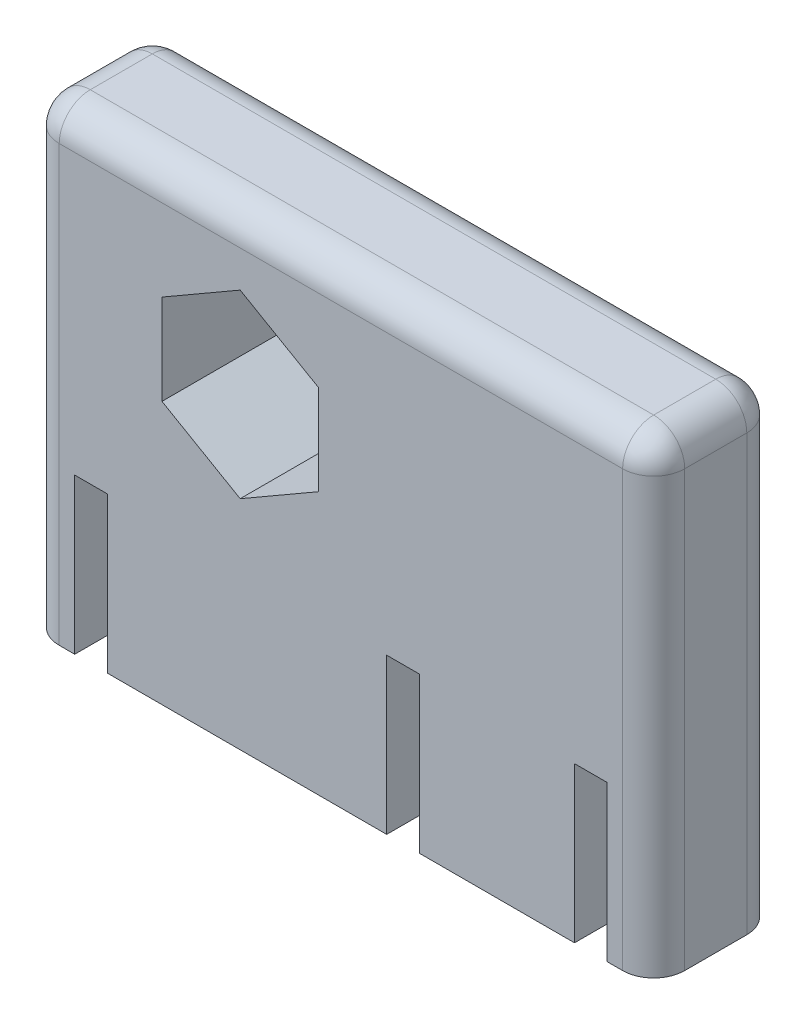
ISO-10303-21;
HEADER;
FILE_DESCRIPTION(('STEP AP214'),'2;1');
FILE_NAME('part.step','',(''),(''),'','','');
FILE_SCHEMA(('AUTOMOTIVE_DESIGN { 1 0 10303 214 1 1 1 1 }'));
ENDSEC;
DATA;
#1=APPLICATION_CONTEXT('core data for automotive mechanical design processes');
#2=APPLICATION_PROTOCOL_DEFINITION('international standard','automotive_design',2000,#1);
#3=PRODUCT_CONTEXT('',#1,'mechanical');
#4=PRODUCT('Part','Part','',(#3));
#5=PRODUCT_RELATED_PRODUCT_CATEGORY('part','',(#4));
#6=PRODUCT_DEFINITION_FORMATION('','',#4);
#7=PRODUCT_DEFINITION_CONTEXT('part definition',#1,'design');
#8=PRODUCT_DEFINITION('design','',#6,#7);
#9=PRODUCT_DEFINITION_SHAPE('','',#8);
#10=(LENGTH_UNIT() NAMED_UNIT(*) SI_UNIT(.MILLI.,.METRE.));
#11=(NAMED_UNIT(*) PLANE_ANGLE_UNIT() SI_UNIT($,.RADIAN.));
#12=(NAMED_UNIT(*) SI_UNIT($,.STERADIAN.) SOLID_ANGLE_UNIT());
#13=UNCERTAINTY_MEASURE_WITH_UNIT(LENGTH_MEASURE(1.E-05),#10,'distance_accuracy_value','');
#14=(GEOMETRIC_REPRESENTATION_CONTEXT(3) GLOBAL_UNCERTAINTY_ASSIGNED_CONTEXT((#13)) GLOBAL_UNIT_ASSIGNED_CONTEXT((#10,
#11,#12)) REPRESENTATION_CONTEXT('',''));
#15=CARTESIAN_POINT('',(0.,0.,0.));
#16=DIRECTION('',(0.,0.,1.));
#17=DIRECTION('',(1.,0.,0.));
#18=AXIS2_PLACEMENT_3D('',#15,#16,#17);
#19=CARTESIAN_POINT('',(0.,0.,8.));
#20=DIRECTION('',(0.,0.,-1.));
#21=DIRECTION('',(-1.,0.,0.));
#22=AXIS2_PLACEMENT_3D('',#19,#20,#21);
#23=PLANE('',#22);
#24=DIRECTION('',(-1.,0.,0.));
#25=VECTOR('',#24,1.);
#26=CARTESIAN_POINT('',(0.,13.,8.));
#27=LINE('',#26,#25);
#28=CARTESIAN_POINT('',(18.15,13.,8.));
#29=VERTEX_POINT('',#28);
#30=CARTESIAN_POINT('',(-18.15,13.,8.));
#31=VERTEX_POINT('',#30);
#32=EDGE_CURVE('E65',#29,#31,#27,.T.);
#33=ORIENTED_EDGE('',*,*,#32,.T.);
#34=DIRECTION('',(0.,-1.,0.));
#35=VECTOR('',#34,1.);
#36=CARTESIAN_POINT('',(-18.15,0.,8.));
#37=LINE('',#36,#35);
#38=CARTESIAN_POINT('',(-18.15,-15.,8.));
#39=VERTEX_POINT('',#38);
#40=EDGE_CURVE('E521',#31,#39,#37,.T.);
#41=ORIENTED_EDGE('',*,*,#40,.T.);
#42=DIRECTION('',(1.,0.,0.));
#43=VECTOR('',#42,1.);
#44=CARTESIAN_POINT('',(-20.15,-15.,8.));
#45=LINE('',#44,#43);
#46=CARTESIAN_POINT('',(-17.15,-15.,8.));
#47=VERTEX_POINT('',#46);
#48=EDGE_CURVE('E312',#39,#47,#45,.T.);
#49=ORIENTED_EDGE('',*,*,#48,.T.);
#50=DIRECTION('',(0.,1.,0.));
#51=VECTOR('',#50,1.);
#52=CARTESIAN_POINT('',(-17.15,-15.,8.));
#53=LINE('',#52,#51);
#54=CARTESIAN_POINT('',(-17.15,-5.,8.));
#55=VERTEX_POINT('',#54);
#56=EDGE_CURVE('E315',#47,#55,#53,.T.);
#57=ORIENTED_EDGE('',*,*,#56,.T.);
#58=DIRECTION('',(1.,0.,0.));
#59=VECTOR('',#58,1.);
#60=CARTESIAN_POINT('',(-17.15,-5.,8.));
#61=LINE('',#60,#59);
#62=CARTESIAN_POINT('',(-15.05,-5.,8.));
#63=VERTEX_POINT('',#62);
#64=EDGE_CURVE('E319',#55,#63,#61,.T.);
#65=ORIENTED_EDGE('',*,*,#64,.T.);
#66=DIRECTION('',(0.,-1.,0.));
#67=VECTOR('',#66,1.);
#68=CARTESIAN_POINT('',(-15.05,-5.,8.));
#69=LINE('',#68,#67);
#70=CARTESIAN_POINT('',(-15.05,-15.,8.));
#71=VERTEX_POINT('',#70);
#72=EDGE_CURVE('E322',#63,#71,#69,.T.);
#73=ORIENTED_EDGE('',*,*,#72,.T.);
#74=DIRECTION('',(1.,0.,0.));
#75=VECTOR('',#74,1.);
#76=CARTESIAN_POINT('',(-15.05,-15.,8.));
#77=LINE('',#76,#75);
#78=CARTESIAN_POINT('',(2.95,-15.,8.));
#79=VERTEX_POINT('',#78);
#80=EDGE_CURVE('E325',#71,#79,#77,.T.);
#81=ORIENTED_EDGE('',*,*,#80,.T.);
#82=DIRECTION('',(0.,1.,0.));
#83=VECTOR('',#82,1.);
#84=CARTESIAN_POINT('',(2.95,-15.,8.));
#85=LINE('',#84,#83);
#86=CARTESIAN_POINT('',(2.95,-5.,8.));
#87=VERTEX_POINT('',#86);
#88=EDGE_CURVE('E328',#79,#87,#85,.T.);
#89=ORIENTED_EDGE('',*,*,#88,.T.);
#90=DIRECTION('',(1.,0.,0.));
#91=VECTOR('',#90,1.);
#92=CARTESIAN_POINT('',(2.95,-5.,8.));
#93=LINE('',#92,#91);
#94=CARTESIAN_POINT('',(5.05,-5.,8.));
#95=VERTEX_POINT('',#94);
#96=EDGE_CURVE('E331',#87,#95,#93,.T.);
#97=ORIENTED_EDGE('',*,*,#96,.T.);
#98=DIRECTION('',(0.,-1.,0.));
#99=VECTOR('',#98,1.);
#100=CARTESIAN_POINT('',(5.05,-5.,8.));
#101=LINE('',#100,#99);
#102=CARTESIAN_POINT('',(5.05,-15.,8.));
#103=VERTEX_POINT('',#102);
#104=EDGE_CURVE('E334',#95,#103,#101,.T.);
#105=ORIENTED_EDGE('',*,*,#104,.T.);
#106=DIRECTION('',(1.,0.,0.));
#107=VECTOR('',#106,1.);
#108=CARTESIAN_POINT('',(5.05,-15.,8.));
#109=LINE('',#108,#107);
#110=CARTESIAN_POINT('',(15.05,-15.,8.));
#111=VERTEX_POINT('',#110);
#112=EDGE_CURVE('E337',#103,#111,#109,.T.);
#113=ORIENTED_EDGE('',*,*,#112,.T.);
#114=DIRECTION('',(0.,1.,0.));
#115=VECTOR('',#114,1.);
#116=CARTESIAN_POINT('',(15.05,-15.,8.));
#117=LINE('',#116,#115);
#118=CARTESIAN_POINT('',(15.05,-5.,8.));
#119=VERTEX_POINT('',#118);
#120=EDGE_CURVE('E340',#111,#119,#117,.T.);
#121=ORIENTED_EDGE('',*,*,#120,.T.);
#122=DIRECTION('',(1.,0.,0.));
#123=VECTOR('',#122,1.);
#124=CARTESIAN_POINT('',(15.05,-5.,8.));
#125=LINE('',#124,#123);
#126=CARTESIAN_POINT('',(17.15,-5.,8.));
#127=VERTEX_POINT('',#126);
#128=EDGE_CURVE('E343',#119,#127,#125,.T.);
#129=ORIENTED_EDGE('',*,*,#128,.T.);
#130=DIRECTION('',(0.,-1.,0.));
#131=VECTOR('',#130,1.);
#132=CARTESIAN_POINT('',(17.15,-5.,8.));
#133=LINE('',#132,#131);
#134=CARTESIAN_POINT('',(17.15,-15.,8.));
#135=VERTEX_POINT('',#134);
#136=EDGE_CURVE('E346',#127,#135,#133,.T.);
#137=ORIENTED_EDGE('',*,*,#136,.T.);
#138=DIRECTION('',(1.,0.,0.));
#139=VECTOR('',#138,1.);
#140=CARTESIAN_POINT('',(17.15,-15.,8.));
#141=LINE('',#140,#139);
#142=CARTESIAN_POINT('',(18.15,-15.,8.));
#143=VERTEX_POINT('',#142);
#144=EDGE_CURVE('E349',#135,#143,#141,.T.);
#145=ORIENTED_EDGE('',*,*,#144,.T.);
#146=DIRECTION('',(0.,1.,0.));
#147=VECTOR('',#146,1.);
#148=CARTESIAN_POINT('',(18.15,0.,8.));
#149=LINE('',#148,#147);
#150=EDGE_CURVE('E455',#143,#29,#149,.T.);
#151=ORIENTED_EDGE('',*,*,#150,.T.);
#152=EDGE_LOOP('',(#33,#41,#49,#57,#65,#73,#81,#89,#97,#105,#113,#121,#129,#137,#145,#151));
#153=FACE_BOUND('',#152,.T.);
#154=DIRECTION('',(0.,1.,0.));
#155=VECTOR('',#154,1.);
#156=CARTESIAN_POINT('',(-1.44979779988866,1.92126963079441,8.));
#157=LINE('',#156,#155);
#158=CARTESIAN_POINT('',(-1.44979779988866,1.92126963079441,8.));
#159=VERTEX_POINT('',#158);
#160=CARTESIAN_POINT('',(-1.44979779988862,7.74096034422584,8.));
#161=VERTEX_POINT('',#160);
#162=EDGE_CURVE('E237',#159,#161,#157,.T.);
#163=ORIENTED_EDGE('',*,*,#162,.F.);
#164=DIRECTION('',(0.866025403784442,0.499999999999994,0.));
#165=VECTOR('',#164,1.);
#166=CARTESIAN_POINT('',(-6.48979779988868,-0.988575725921271,8.));
#167=LINE('',#166,#165);
#168=CARTESIAN_POINT('',(-6.48979779988868,-0.98857572592127,8.));
#169=VERTEX_POINT('',#168);
#170=EDGE_CURVE('E275',#169,#159,#167,.T.);
#171=ORIENTED_EDGE('',*,*,#170,.F.);
#172=DIRECTION('',(0.866025403784435,-0.500000000000006,0.));
#173=VECTOR('',#172,1.);
#174=CARTESIAN_POINT('',(-11.5297977998887,1.92126963079448,8.));
#175=LINE('',#174,#173);
#176=CARTESIAN_POINT('',(-11.5297977998887,1.92126963079448,8.));
#177=VERTEX_POINT('',#176);
#178=EDGE_CURVE('E271',#177,#169,#175,.T.);
#179=ORIENTED_EDGE('',*,*,#178,.F.);
#180=DIRECTION('',(0.,-1.,0.));
#181=VECTOR('',#180,1.);
#182=CARTESIAN_POINT('',(-11.5297977998886,7.74096034422591,8.));
#183=LINE('',#182,#181);
#184=CARTESIAN_POINT('',(-11.5297977998886,7.74096034422591,8.));
#185=VERTEX_POINT('',#184);
#186=EDGE_CURVE('E266',#185,#177,#183,.T.);
#187=ORIENTED_EDGE('',*,*,#186,.F.);
#188=DIRECTION('',(-0.866025403784442,-0.499999999999994,0.));
#189=VECTOR('',#188,1.);
#190=CARTESIAN_POINT('',(-6.4897977998886,10.6508057009416,8.));
#191=LINE('',#190,#189);
#192=CARTESIAN_POINT('',(-6.4897977998886,10.6508057009416,8.));
#193=VERTEX_POINT('',#192);
#194=EDGE_CURVE('E262',#193,#185,#191,.T.);
#195=ORIENTED_EDGE('',*,*,#194,.F.);
#196=DIRECTION('',(-0.866025403784435,0.500000000000006,0.));
#197=VECTOR('',#196,1.);
#198=CARTESIAN_POINT('',(-1.44979779988862,7.74096034422584,8.));
#199=LINE('',#198,#197);
#200=EDGE_CURVE('E248',#161,#193,#199,.T.);
#201=ORIENTED_EDGE('',*,*,#200,.F.);
#202=EDGE_LOOP('',(#163,#171,#179,#187,#195,#201));
#203=FACE_BOUND('',#202,.T.);
#204=ADVANCED_FACE('F47',(#153,#203),#23,.F.);
#205=CARTESIAN_POINT('',(0.,0.,0.));
#206=DIRECTION('',(0.,0.,-1.));
#207=DIRECTION('',(-1.,0.,0.));
#208=AXIS2_PLACEMENT_3D('',#205,#206,#207);
#209=PLANE('',#208);
#210=DIRECTION('',(1.,0.,0.));
#211=VECTOR('',#210,1.);
#212=CARTESIAN_POINT('',(-20.15,-15.,0.));
#213=LINE('',#212,#211);
#214=CARTESIAN_POINT('',(-18.15,-15.,0.));
#215=VERTEX_POINT('',#214);
#216=CARTESIAN_POINT('',(-17.15,-15.,0.));
#217=VERTEX_POINT('',#216);
#218=EDGE_CURVE('E257',#215,#217,#213,.T.);
#219=ORIENTED_EDGE('',*,*,#218,.F.);
#220=DIRECTION('',(0.,-1.,0.));
#221=VECTOR('',#220,1.);
#222=CARTESIAN_POINT('',(-18.15,13.,0.));
#223=LINE('',#222,#221);
#224=CARTESIAN_POINT('',(-18.15,13.,0.));
#225=VERTEX_POINT('',#224);
#226=EDGE_CURVE('E73',#215,#225,#223,.F.);
#227=ORIENTED_EDGE('',*,*,#226,.T.);
#228=DIRECTION('',(-1.,0.,0.));
#229=VECTOR('',#228,1.);
#230=CARTESIAN_POINT('',(18.15,13.,0.));
#231=LINE('',#230,#229);
#232=CARTESIAN_POINT('',(18.15,13.,0.));
#233=VERTEX_POINT('',#232);
#234=EDGE_CURVE('E514',#225,#233,#231,.F.);
#235=ORIENTED_EDGE('',*,*,#234,.T.);
#236=DIRECTION('',(0.,1.,0.));
#237=VECTOR('',#236,1.);
#238=CARTESIAN_POINT('',(18.15,-15.,0.));
#239=LINE('',#238,#237);
#240=CARTESIAN_POINT('',(18.15,-15.,0.));
#241=VERTEX_POINT('',#240);
#242=EDGE_CURVE('E475',#233,#241,#239,.F.);
#243=ORIENTED_EDGE('',*,*,#242,.T.);
#244=DIRECTION('',(1.,0.,0.));
#245=VECTOR('',#244,1.);
#246=CARTESIAN_POINT('',(17.15,-15.,0.));
#247=LINE('',#246,#245);
#248=CARTESIAN_POINT('',(17.15,-15.,0.));
#249=VERTEX_POINT('',#248);
#250=EDGE_CURVE('E316',#249,#241,#247,.T.);
#251=ORIENTED_EDGE('',*,*,#250,.F.);
#252=DIRECTION('',(0.,-1.,0.));
#253=VECTOR('',#252,1.);
#254=CARTESIAN_POINT('',(17.15,-5.,0.));
#255=LINE('',#254,#253);
#256=CARTESIAN_POINT('',(17.15,-5.,0.));
#257=VERTEX_POINT('',#256);
#258=EDGE_CURVE('E386',#257,#249,#255,.T.);
#259=ORIENTED_EDGE('',*,*,#258,.F.);
#260=DIRECTION('',(1.,0.,0.));
#261=VECTOR('',#260,1.);
#262=CARTESIAN_POINT('',(15.05,-5.,0.));
#263=LINE('',#262,#261);
#264=CARTESIAN_POINT('',(15.05,-5.,0.));
#265=VERTEX_POINT('',#264);
#266=EDGE_CURVE('E383',#265,#257,#263,.T.);
#267=ORIENTED_EDGE('',*,*,#266,.F.);
#268=DIRECTION('',(0.,1.,0.));
#269=VECTOR('',#268,1.);
#270=CARTESIAN_POINT('',(15.05,-15.,0.));
#271=LINE('',#270,#269);
#272=CARTESIAN_POINT('',(15.05,-15.,0.));
#273=VERTEX_POINT('',#272);
#274=EDGE_CURVE('E380',#273,#265,#271,.T.);
#275=ORIENTED_EDGE('',*,*,#274,.F.);
#276=DIRECTION('',(1.,0.,0.));
#277=VECTOR('',#276,1.);
#278=CARTESIAN_POINT('',(5.05,-15.,0.));
#279=LINE('',#278,#277);
#280=CARTESIAN_POINT('',(5.05,-15.,0.));
#281=VERTEX_POINT('',#280);
#282=EDGE_CURVE('E377',#281,#273,#279,.T.);
#283=ORIENTED_EDGE('',*,*,#282,.F.);
#284=DIRECTION('',(0.,-1.,0.));
#285=VECTOR('',#284,1.);
#286=CARTESIAN_POINT('',(5.05,-5.,0.));
#287=LINE('',#286,#285);
#288=CARTESIAN_POINT('',(5.05,-5.,0.));
#289=VERTEX_POINT('',#288);
#290=EDGE_CURVE('E374',#289,#281,#287,.T.);
#291=ORIENTED_EDGE('',*,*,#290,.F.);
#292=DIRECTION('',(1.,0.,0.));
#293=VECTOR('',#292,1.);
#294=CARTESIAN_POINT('',(2.95,-5.,0.));
#295=LINE('',#294,#293);
#296=CARTESIAN_POINT('',(2.95,-5.,0.));
#297=VERTEX_POINT('',#296);
#298=EDGE_CURVE('E371',#297,#289,#295,.T.);
#299=ORIENTED_EDGE('',*,*,#298,.F.);
#300=DIRECTION('',(0.,1.,0.));
#301=VECTOR('',#300,1.);
#302=CARTESIAN_POINT('',(2.95,-15.,0.));
#303=LINE('',#302,#301);
#304=CARTESIAN_POINT('',(2.95,-15.,0.));
#305=VERTEX_POINT('',#304);
#306=EDGE_CURVE('E368',#305,#297,#303,.T.);
#307=ORIENTED_EDGE('',*,*,#306,.F.);
#308=DIRECTION('',(1.,0.,0.));
#309=VECTOR('',#308,1.);
#310=CARTESIAN_POINT('',(-15.05,-15.,0.));
#311=LINE('',#310,#309);
#312=CARTESIAN_POINT('',(-15.05,-15.,0.));
#313=VERTEX_POINT('',#312);
#314=EDGE_CURVE('E365',#313,#305,#311,.T.);
#315=ORIENTED_EDGE('',*,*,#314,.F.);
#316=DIRECTION('',(0.,-1.,0.));
#317=VECTOR('',#316,1.);
#318=CARTESIAN_POINT('',(-15.05,-5.,0.));
#319=LINE('',#318,#317);
#320=CARTESIAN_POINT('',(-15.05,-5.,0.));
#321=VERTEX_POINT('',#320);
#322=EDGE_CURVE('E362',#321,#313,#319,.T.);
#323=ORIENTED_EDGE('',*,*,#322,.F.);
#324=DIRECTION('',(1.,0.,0.));
#325=VECTOR('',#324,1.);
#326=CARTESIAN_POINT('',(-17.15,-5.,0.));
#327=LINE('',#326,#325);
#328=CARTESIAN_POINT('',(-17.15,-5.,0.));
#329=VERTEX_POINT('',#328);
#330=EDGE_CURVE('E359',#329,#321,#327,.T.);
#331=ORIENTED_EDGE('',*,*,#330,.F.);
#332=DIRECTION('',(0.,1.,0.));
#333=VECTOR('',#332,1.);
#334=CARTESIAN_POINT('',(-17.15,-15.,0.));
#335=LINE('',#334,#333);
#336=EDGE_CURVE('E356',#217,#329,#335,.T.);
#337=ORIENTED_EDGE('',*,*,#336,.F.);
#338=EDGE_LOOP('',(#219,#227,#235,#243,#251,#259,#267,#275,#283,#291,#299,#307,#315,#323,#331,#337));
#339=FACE_BOUND('',#338,.T.);
#340=DIRECTION('',(0.866025403784442,0.499999999999994,0.));
#341=VECTOR('',#340,1.);
#342=CARTESIAN_POINT('',(-6.48979779988868,-0.988575725921271,0.));
#343=LINE('',#342,#341);
#344=CARTESIAN_POINT('',(-6.48979779988868,-0.988575725921271,0.));
#345=VERTEX_POINT('',#344);
#346=CARTESIAN_POINT('',(-1.44979779988866,1.92126963079441,0.));
#347=VERTEX_POINT('',#346);
#348=EDGE_CURVE('E249',#345,#347,#343,.T.);
#349=ORIENTED_EDGE('',*,*,#348,.T.);
#350=DIRECTION('',(0.,1.,0.));
#351=VECTOR('',#350,1.);
#352=CARTESIAN_POINT('',(-1.44979779988866,1.92126963079441,0.));
#353=LINE('',#352,#351);
#354=CARTESIAN_POINT('',(-1.44979779988862,7.74096034422584,0.));
#355=VERTEX_POINT('',#354);
#356=EDGE_CURVE('E278',#347,#355,#353,.T.);
#357=ORIENTED_EDGE('',*,*,#356,.T.);
#358=DIRECTION('',(-0.866025403784435,0.500000000000006,0.));
#359=VECTOR('',#358,1.);
#360=CARTESIAN_POINT('',(-1.44979779988862,7.74096034422584,0.));
#361=LINE('',#360,#359);
#362=CARTESIAN_POINT('',(-6.4897977998886,10.6508057009416,0.));
#363=VERTEX_POINT('',#362);
#364=EDGE_CURVE('E255',#355,#363,#361,.T.);
#365=ORIENTED_EDGE('',*,*,#364,.T.);
#366=DIRECTION('',(-0.866025403784442,-0.499999999999994,0.));
#367=VECTOR('',#366,1.);
#368=CARTESIAN_POINT('',(-6.4897977998886,10.6508057009416,0.));
#369=LINE('',#368,#367);
#370=CARTESIAN_POINT('',(-11.5297977998886,7.74096034422591,0.));
#371=VERTEX_POINT('',#370);
#372=EDGE_CURVE('E284',#363,#371,#369,.T.);
#373=ORIENTED_EDGE('',*,*,#372,.T.);
#374=DIRECTION('',(0.,-1.,0.));
#375=VECTOR('',#374,1.);
#376=CARTESIAN_POINT('',(-11.5297977998886,7.74096034422591,0.));
#377=LINE('',#376,#375);
#378=CARTESIAN_POINT('',(-11.5297977998887,1.92126963079448,0.));
#379=VERTEX_POINT('',#378);
#380=EDGE_CURVE('E288',#371,#379,#377,.T.);
#381=ORIENTED_EDGE('',*,*,#380,.T.);
#382=DIRECTION('',(0.866025403784435,-0.500000000000006,0.));
#383=VECTOR('',#382,1.);
#384=CARTESIAN_POINT('',(-11.5297977998887,1.92126963079448,0.));
#385=LINE('',#384,#383);
#386=EDGE_CURVE('E292',#379,#345,#385,.T.);
#387=ORIENTED_EDGE('',*,*,#386,.T.);
#388=EDGE_LOOP('',(#349,#357,#365,#373,#381,#387));
#389=FACE_BOUND('',#388,.T.);
#390=ADVANCED_FACE('F609',(#339,#389),#209,.T.);
#391=CARTESIAN_POINT('',(20.15,-15.,8.));
#392=DIRECTION('',(-1.,0.,0.));
#393=DIRECTION('',(0.,0.,1.));
#394=AXIS2_PLACEMENT_3D('',#391,#392,#393);
#395=PLANE('',#394);
#396=DIRECTION('',(0.,0.,-1.));
#397=VECTOR('',#396,1.);
#398=CARTESIAN_POINT('',(20.15,13.,8.));
#399=LINE('',#398,#397);
#400=CARTESIAN_POINT('',(20.15,13.,2.));
#401=VERTEX_POINT('',#400);
#402=CARTESIAN_POINT('',(20.15,13.,6.));
#403=VERTEX_POINT('',#402);
#404=EDGE_CURVE('E458',#401,#403,#399,.F.);
#405=ORIENTED_EDGE('',*,*,#404,.T.);
#406=DIRECTION('',(0.,1.,0.));
#407=VECTOR('',#406,1.);
#408=CARTESIAN_POINT('',(20.15,-15.,6.));
#409=LINE('',#408,#407);
#410=CARTESIAN_POINT('',(20.15,-15.,6.));
#411=VERTEX_POINT('',#410);
#412=EDGE_CURVE('E466',#403,#411,#409,.F.);
#413=ORIENTED_EDGE('',*,*,#412,.T.);
#414=DIRECTION('',(0.,0.,-1.));
#415=VECTOR('',#414,1.);
#416=CARTESIAN_POINT('',(20.15,-15.,8.));
#417=LINE('',#416,#415);
#418=CARTESIAN_POINT('',(20.15,-15.,2.));
#419=VERTEX_POINT('',#418);
#420=EDGE_CURVE('E353',#411,#419,#417,.T.);
#421=ORIENTED_EDGE('',*,*,#420,.T.);
#422=DIRECTION('',(0.,1.,0.));
#423=VECTOR('',#422,1.);
#424=CARTESIAN_POINT('',(20.15,15.,2.));
#425=LINE('',#424,#423);
#426=EDGE_CURVE('E462',#419,#401,#425,.T.);
#427=ORIENTED_EDGE('',*,*,#426,.T.);
#428=EDGE_LOOP('',(#405,#413,#421,#427));
#429=FACE_BOUND('',#428,.T.);
#430=ADVANCED_FACE('F590',(#429),#395,.F.);
#431=CARTESIAN_POINT('',(-20.15,15.,8.));
#432=DIRECTION('',(0.,-1.,0.));
#433=DIRECTION('',(0.,0.,-1.));
#434=AXIS2_PLACEMENT_3D('',#431,#432,#433);
#435=PLANE('',#434);
#436=DIRECTION('',(0.,0.,-1.));
#437=VECTOR('',#436,1.);
#438=CARTESIAN_POINT('',(-18.15,15.,8.));
#439=LINE('',#438,#437);
#440=CARTESIAN_POINT('',(-18.15,15.,2.));
#441=VERTEX_POINT('',#440);
#442=CARTESIAN_POINT('',(-18.15,15.,6.));
#443=VERTEX_POINT('',#442);
#444=EDGE_CURVE('E451',#441,#443,#439,.F.);
#445=ORIENTED_EDGE('',*,*,#444,.T.);
#446=DIRECTION('',(-1.,0.,0.));
#447=VECTOR('',#446,1.);
#448=CARTESIAN_POINT('',(-20.15,15.,6.));
#449=LINE('',#448,#447);
#450=CARTESIAN_POINT('',(18.15,15.,6.));
#451=VERTEX_POINT('',#450);
#452=EDGE_CURVE('E11',#443,#451,#449,.F.);
#453=ORIENTED_EDGE('',*,*,#452,.T.);
#454=DIRECTION('',(0.,0.,-1.));
#455=VECTOR('',#454,1.);
#456=CARTESIAN_POINT('',(18.15,15.,8.));
#457=LINE('',#456,#455);
#458=CARTESIAN_POINT('',(18.15,15.,2.));
#459=VERTEX_POINT('',#458);
#460=EDGE_CURVE('E478',#451,#459,#457,.T.);
#461=ORIENTED_EDGE('',*,*,#460,.T.);
#462=DIRECTION('',(-1.,0.,0.));
#463=VECTOR('',#462,1.);
#464=CARTESIAN_POINT('',(-18.15,15.,2.));
#465=LINE('',#464,#463);
#466=EDGE_CURVE('E57',#459,#441,#465,.T.);
#467=ORIENTED_EDGE('',*,*,#466,.T.);
#468=EDGE_LOOP('',(#445,#453,#461,#467));
#469=FACE_BOUND('',#468,.T.);
#470=ADVANCED_FACE('F572',(#469),#435,.F.);
#471=CARTESIAN_POINT('',(-20.15,-15.,8.));
#472=DIRECTION('',(1.,0.,0.));
#473=DIRECTION('',(0.,0.,-1.));
#474=AXIS2_PLACEMENT_3D('',#471,#472,#473);
#475=PLANE('',#474);
#476=DIRECTION('',(0.,0.,-1.));
#477=VECTOR('',#476,1.);
#478=CARTESIAN_POINT('',(-20.15,13.,8.));
#479=LINE('',#478,#477);
#480=CARTESIAN_POINT('',(-20.15,13.,6.));
#481=VERTEX_POINT('',#480);
#482=CARTESIAN_POINT('',(-20.15,13.,2.));
#483=VERTEX_POINT('',#482);
#484=EDGE_CURVE('E447',#481,#483,#479,.T.);
#485=ORIENTED_EDGE('',*,*,#484,.T.);
#486=DIRECTION('',(0.,-1.,0.));
#487=VECTOR('',#486,1.);
#488=CARTESIAN_POINT('',(-20.15,-15.,2.));
#489=LINE('',#488,#487);
#490=CARTESIAN_POINT('',(-20.15,-15.,2.));
#491=VERTEX_POINT('',#490);
#492=EDGE_CURVE('E505',#483,#491,#489,.T.);
#493=ORIENTED_EDGE('',*,*,#492,.T.);
#494=DIRECTION('',(0.,0.,-1.));
#495=VECTOR('',#494,1.);
#496=CARTESIAN_POINT('',(-20.15,-15.,8.));
#497=LINE('',#496,#495);
#498=CARTESIAN_POINT('',(-20.15,-15.,6.));
#499=VERTEX_POINT('',#498);
#500=EDGE_CURVE('E443',#499,#491,#497,.T.);
#501=ORIENTED_EDGE('',*,*,#500,.F.);
#502=DIRECTION('',(0.,-1.,0.));
#503=VECTOR('',#502,1.);
#504=CARTESIAN_POINT('',(-20.15,-15.,6.));
#505=LINE('',#504,#503);
#506=EDGE_CURVE('E502',#499,#481,#505,.F.);
#507=ORIENTED_EDGE('',*,*,#506,.T.);
#508=EDGE_LOOP('',(#485,#493,#501,#507));
#509=FACE_BOUND('',#508,.T.);
#510=ADVANCED_FACE('F555',(#509),#475,.F.);
#511=CARTESIAN_POINT('',(-20.15,-15.,8.));
#512=DIRECTION('',(0.,1.,0.));
#513=DIRECTION('',(0.,0.,1.));
#514=AXIS2_PLACEMENT_3D('',#511,#512,#513);
#515=PLANE('',#514);
#516=ORIENTED_EDGE('',*,*,#500,.T.);
#517=CARTESIAN_POINT('',(-18.15,-15.,2.));
#518=DIRECTION('',(0.,1.,0.));
#519=DIRECTION('',(0.,0.,1.));
#520=AXIS2_PLACEMENT_3D('',#517,#518,#519);
#521=CIRCLE('',#520,2.);
#522=EDGE_CURVE('E511',#491,#215,#521,.F.);
#523=ORIENTED_EDGE('',*,*,#522,.T.);
#524=ORIENTED_EDGE('',*,*,#218,.T.);
#525=DIRECTION('',(0.,0.,-1.));
#526=VECTOR('',#525,1.);
#527=CARTESIAN_POINT('',(-17.15,-15.,8.));
#528=LINE('',#527,#526);
#529=EDGE_CURVE('E439',#47,#217,#528,.T.);
#530=ORIENTED_EDGE('',*,*,#529,.F.);
#531=ORIENTED_EDGE('',*,*,#48,.F.);
#532=CARTESIAN_POINT('',(-18.15,-15.,6.));
#533=DIRECTION('',(0.,1.,0.));
#534=DIRECTION('',(0.,0.,1.));
#535=AXIS2_PLACEMENT_3D('',#532,#533,#534);
#536=CIRCLE('',#535,2.);
#537=EDGE_CURVE('E508',#39,#499,#536,.F.);
#538=ORIENTED_EDGE('',*,*,#537,.T.);
#539=EDGE_LOOP('',(#516,#523,#524,#530,#531,#538));
#540=FACE_BOUND('',#539,.T.);
#541=ADVANCED_FACE('F559',(#540),#515,.F.);
#542=CARTESIAN_POINT('',(-17.15,-15.,8.));
#543=DIRECTION('',(-1.,0.,0.));
#544=DIRECTION('',(0.,-1.,0.));
#545=AXIS2_PLACEMENT_3D('',#542,#543,#544);
#546=PLANE('',#545);
#547=ORIENTED_EDGE('',*,*,#336,.T.);
#548=DIRECTION('',(0.,0.,-1.));
#549=VECTOR('',#548,1.);
#550=CARTESIAN_POINT('',(-17.15,-5.,8.));
#551=LINE('',#550,#549);
#552=EDGE_CURVE('E435',#55,#329,#551,.T.);
#553=ORIENTED_EDGE('',*,*,#552,.F.);
#554=ORIENTED_EDGE('',*,*,#56,.F.);
#555=ORIENTED_EDGE('',*,*,#529,.T.);
#556=EDGE_LOOP('',(#547,#553,#554,#555));
#557=FACE_BOUND('',#556,.T.);
#558=ADVANCED_FACE('F675',(#557),#546,.F.);
#559=CARTESIAN_POINT('',(-17.15,-5.,8.));
#560=DIRECTION('',(0.,1.,0.));
#561=DIRECTION('',(0.,0.,1.));
#562=AXIS2_PLACEMENT_3D('',#559,#560,#561);
#563=PLANE('',#562);
#564=ORIENTED_EDGE('',*,*,#330,.T.);
#565=DIRECTION('',(0.,0.,-1.));
#566=VECTOR('',#565,1.);
#567=CARTESIAN_POINT('',(-15.05,-5.,8.));
#568=LINE('',#567,#566);
#569=EDGE_CURVE('E431',#63,#321,#568,.T.);
#570=ORIENTED_EDGE('',*,*,#569,.F.);
#571=ORIENTED_EDGE('',*,*,#64,.F.);
#572=ORIENTED_EDGE('',*,*,#552,.T.);
#573=EDGE_LOOP('',(#564,#570,#571,#572));
#574=FACE_BOUND('',#573,.T.);
#575=ADVANCED_FACE('F671',(#574),#563,.F.);
#576=CARTESIAN_POINT('',(-15.05,-5.,8.));
#577=DIRECTION('',(1.,0.,0.));
#578=DIRECTION('',(0.,1.,0.));
#579=AXIS2_PLACEMENT_3D('',#576,#577,#578);
#580=PLANE('',#579);
#581=ORIENTED_EDGE('',*,*,#322,.T.);
#582=DIRECTION('',(0.,0.,-1.));
#583=VECTOR('',#582,1.);
#584=CARTESIAN_POINT('',(-15.05,-15.,8.));
#585=LINE('',#584,#583);
#586=EDGE_CURVE('E427',#71,#313,#585,.T.);
#587=ORIENTED_EDGE('',*,*,#586,.F.);
#588=ORIENTED_EDGE('',*,*,#72,.F.);
#589=ORIENTED_EDGE('',*,*,#569,.T.);
#590=EDGE_LOOP('',(#581,#587,#588,#589));
#591=FACE_BOUND('',#590,.T.);
#592=ADVANCED_FACE('F667',(#591),#580,.F.);
#593=CARTESIAN_POINT('',(-15.05,-15.,8.));
#594=DIRECTION('',(0.,1.,0.));
#595=DIRECTION('',(0.,0.,1.));
#596=AXIS2_PLACEMENT_3D('',#593,#594,#595);
#597=PLANE('',#596);
#598=ORIENTED_EDGE('',*,*,#314,.T.);
#599=DIRECTION('',(0.,0.,-1.));
#600=VECTOR('',#599,1.);
#601=CARTESIAN_POINT('',(2.95,-15.,8.));
#602=LINE('',#601,#600);
#603=EDGE_CURVE('E423',#79,#305,#602,.T.);
#604=ORIENTED_EDGE('',*,*,#603,.F.);
#605=ORIENTED_EDGE('',*,*,#80,.F.);
#606=ORIENTED_EDGE('',*,*,#586,.T.);
#607=EDGE_LOOP('',(#598,#604,#605,#606));
#608=FACE_BOUND('',#607,.T.);
#609=ADVANCED_FACE('F663',(#608),#597,.F.);
#610=CARTESIAN_POINT('',(2.95,-15.,8.));
#611=DIRECTION('',(-1.,0.,0.));
#612=DIRECTION('',(0.,-1.,0.));
#613=AXIS2_PLACEMENT_3D('',#610,#611,#612);
#614=PLANE('',#613);
#615=ORIENTED_EDGE('',*,*,#306,.T.);
#616=DIRECTION('',(0.,0.,-1.));
#617=VECTOR('',#616,1.);
#618=CARTESIAN_POINT('',(2.95,-5.,8.));
#619=LINE('',#618,#617);
#620=EDGE_CURVE('E419',#87,#297,#619,.T.);
#621=ORIENTED_EDGE('',*,*,#620,.F.);
#622=ORIENTED_EDGE('',*,*,#88,.F.);
#623=ORIENTED_EDGE('',*,*,#603,.T.);
#624=EDGE_LOOP('',(#615,#621,#622,#623));
#625=FACE_BOUND('',#624,.T.);
#626=ADVANCED_FACE('F659',(#625),#614,.F.);
#627=CARTESIAN_POINT('',(2.95,-5.,8.));
#628=DIRECTION('',(0.,1.,0.));
#629=DIRECTION('',(0.,0.,1.));
#630=AXIS2_PLACEMENT_3D('',#627,#628,#629);
#631=PLANE('',#630);
#632=ORIENTED_EDGE('',*,*,#298,.T.);
#633=DIRECTION('',(0.,0.,-1.));
#634=VECTOR('',#633,1.);
#635=CARTESIAN_POINT('',(5.05,-5.,8.));
#636=LINE('',#635,#634);
#637=EDGE_CURVE('E415',#95,#289,#636,.T.);
#638=ORIENTED_EDGE('',*,*,#637,.F.);
#639=ORIENTED_EDGE('',*,*,#96,.F.);
#640=ORIENTED_EDGE('',*,*,#620,.T.);
#641=EDGE_LOOP('',(#632,#638,#639,#640));
#642=FACE_BOUND('',#641,.T.);
#643=ADVANCED_FACE('F655',(#642),#631,.F.);
#644=CARTESIAN_POINT('',(5.05,-5.,8.));
#645=DIRECTION('',(1.,0.,0.));
#646=DIRECTION('',(0.,1.,0.));
#647=AXIS2_PLACEMENT_3D('',#644,#645,#646);
#648=PLANE('',#647);
#649=ORIENTED_EDGE('',*,*,#290,.T.);
#650=DIRECTION('',(0.,0.,-1.));
#651=VECTOR('',#650,1.);
#652=CARTESIAN_POINT('',(5.05,-15.,8.));
#653=LINE('',#652,#651);
#654=EDGE_CURVE('E411',#103,#281,#653,.T.);
#655=ORIENTED_EDGE('',*,*,#654,.F.);
#656=ORIENTED_EDGE('',*,*,#104,.F.);
#657=ORIENTED_EDGE('',*,*,#637,.T.);
#658=EDGE_LOOP('',(#649,#655,#656,#657));
#659=FACE_BOUND('',#658,.T.);
#660=ADVANCED_FACE('F651',(#659),#648,.F.);
#661=CARTESIAN_POINT('',(5.05,-15.,8.));
#662=DIRECTION('',(0.,1.,0.));
#663=DIRECTION('',(0.,0.,1.));
#664=AXIS2_PLACEMENT_3D('',#661,#662,#663);
#665=PLANE('',#664);
#666=ORIENTED_EDGE('',*,*,#282,.T.);
#667=DIRECTION('',(0.,0.,-1.));
#668=VECTOR('',#667,1.);
#669=CARTESIAN_POINT('',(15.05,-15.,8.));
#670=LINE('',#669,#668);
#671=EDGE_CURVE('E407',#111,#273,#670,.T.);
#672=ORIENTED_EDGE('',*,*,#671,.F.);
#673=ORIENTED_EDGE('',*,*,#112,.F.);
#674=ORIENTED_EDGE('',*,*,#654,.T.);
#675=EDGE_LOOP('',(#666,#672,#673,#674));
#676=FACE_BOUND('',#675,.T.);
#677=ADVANCED_FACE('F647',(#676),#665,.F.);
#678=CARTESIAN_POINT('',(15.05,-15.,8.));
#679=DIRECTION('',(-1.,0.,0.));
#680=DIRECTION('',(0.,-1.,0.));
#681=AXIS2_PLACEMENT_3D('',#678,#679,#680);
#682=PLANE('',#681);
#683=ORIENTED_EDGE('',*,*,#274,.T.);
#684=DIRECTION('',(0.,0.,-1.));
#685=VECTOR('',#684,1.);
#686=CARTESIAN_POINT('',(15.05,-5.,8.));
#687=LINE('',#686,#685);
#688=EDGE_CURVE('E403',#119,#265,#687,.T.);
#689=ORIENTED_EDGE('',*,*,#688,.F.);
#690=ORIENTED_EDGE('',*,*,#120,.F.);
#691=ORIENTED_EDGE('',*,*,#671,.T.);
#692=EDGE_LOOP('',(#683,#689,#690,#691));
#693=FACE_BOUND('',#692,.T.);
#694=ADVANCED_FACE('F643',(#693),#682,.F.);
#695=CARTESIAN_POINT('',(15.05,-5.,8.));
#696=DIRECTION('',(0.,1.,0.));
#697=DIRECTION('',(0.,0.,1.));
#698=AXIS2_PLACEMENT_3D('',#695,#696,#697);
#699=PLANE('',#698);
#700=ORIENTED_EDGE('',*,*,#266,.T.);
#701=DIRECTION('',(0.,0.,-1.));
#702=VECTOR('',#701,1.);
#703=CARTESIAN_POINT('',(17.15,-5.,8.));
#704=LINE('',#703,#702);
#705=EDGE_CURVE('E399',#127,#257,#704,.T.);
#706=ORIENTED_EDGE('',*,*,#705,.F.);
#707=ORIENTED_EDGE('',*,*,#128,.F.);
#708=ORIENTED_EDGE('',*,*,#688,.T.);
#709=EDGE_LOOP('',(#700,#706,#707,#708));
#710=FACE_BOUND('',#709,.T.);
#711=ADVANCED_FACE('F640',(#710),#699,.F.);
#712=CARTESIAN_POINT('',(17.15,-5.,8.));
#713=DIRECTION('',(1.,0.,0.));
#714=DIRECTION('',(0.,0.,-1.));
#715=AXIS2_PLACEMENT_3D('',#712,#713,#714);
#716=PLANE('',#715);
#717=ORIENTED_EDGE('',*,*,#258,.T.);
#718=DIRECTION('',(0.,0.,-1.));
#719=VECTOR('',#718,1.);
#720=CARTESIAN_POINT('',(17.15,-15.,8.));
#721=LINE('',#720,#719);
#722=EDGE_CURVE('E395',#135,#249,#721,.T.);
#723=ORIENTED_EDGE('',*,*,#722,.F.);
#724=ORIENTED_EDGE('',*,*,#136,.F.);
#725=ORIENTED_EDGE('',*,*,#705,.T.);
#726=EDGE_LOOP('',(#717,#723,#724,#725));
#727=FACE_BOUND('',#726,.T.);
#728=ADVANCED_FACE('F605',(#727),#716,.F.);
#729=CARTESIAN_POINT('',(17.15,-15.,8.));
#730=DIRECTION('',(0.,1.,0.));
#731=DIRECTION('',(0.,0.,1.));
#732=AXIS2_PLACEMENT_3D('',#729,#730,#731);
#733=PLANE('',#732);
#734=ORIENTED_EDGE('',*,*,#420,.F.);
#735=CARTESIAN_POINT('',(18.15,-15.,6.));
#736=DIRECTION('',(0.,1.,0.));
#737=DIRECTION('',(0.,0.,1.));
#738=AXIS2_PLACEMENT_3D('',#735,#736,#737);
#739=CIRCLE('',#738,2.);
#740=EDGE_CURVE('E472',#411,#143,#739,.F.);
#741=ORIENTED_EDGE('',*,*,#740,.T.);
#742=ORIENTED_EDGE('',*,*,#144,.F.);
#743=ORIENTED_EDGE('',*,*,#722,.T.);
#744=ORIENTED_EDGE('',*,*,#250,.T.);
#745=CARTESIAN_POINT('',(18.15,-15.,2.));
#746=DIRECTION('',(0.,1.,0.));
#747=DIRECTION('',(0.,0.,1.));
#748=AXIS2_PLACEMENT_3D('',#745,#746,#747);
#749=CIRCLE('',#748,2.);
#750=EDGE_CURVE('E469',#241,#419,#749,.F.);
#751=ORIENTED_EDGE('',*,*,#750,.T.);
#752=EDGE_LOOP('',(#734,#741,#742,#743,#744,#751));
#753=FACE_BOUND('',#752,.T.);
#754=ADVANCED_FACE('F599',(#753),#733,.F.);
#755=CARTESIAN_POINT('',(-1.44979779988866,1.92126963079441,8.));
#756=DIRECTION('',(-1.,0.,0.));
#757=DIRECTION('',(0.,-1.,0.));
#758=AXIS2_PLACEMENT_3D('',#755,#756,#757);
#759=PLANE('',#758);
#760=ORIENTED_EDGE('',*,*,#356,.F.);
#761=DIRECTION('',(0.,0.,-1.));
#762=VECTOR('',#761,1.);
#763=CARTESIAN_POINT('',(-1.44979779988866,1.92126963079441,8.));
#764=LINE('',#763,#762);
#765=EDGE_CURVE('E243',#159,#347,#764,.T.);
#766=ORIENTED_EDGE('',*,*,#765,.F.);
#767=ORIENTED_EDGE('',*,*,#162,.T.);
#768=DIRECTION('',(0.,0.,-1.));
#769=VECTOR('',#768,1.);
#770=CARTESIAN_POINT('',(-1.44979779988862,7.74096034422584,8.));
#771=LINE('',#770,#769);
#772=EDGE_CURVE('E240',#161,#355,#771,.T.);
#773=ORIENTED_EDGE('',*,*,#772,.T.);
#774=EDGE_LOOP('',(#760,#766,#767,#773));
#775=FACE_BOUND('',#774,.T.);
#776=ADVANCED_FACE('F239',(#775),#759,.T.);
#777=CARTESIAN_POINT('',(-1.44979779988862,7.74096034422584,8.));
#778=DIRECTION('',(-0.500000000000006,-0.866025403784435,0.));
#779=DIRECTION('',(0.866025403784435,-0.500000000000006,0.));
#780=AXIS2_PLACEMENT_3D('',#777,#778,#779);
#781=PLANE('',#780);
#782=ORIENTED_EDGE('',*,*,#364,.F.);
#783=ORIENTED_EDGE('',*,*,#772,.F.);
#784=ORIENTED_EDGE('',*,*,#200,.T.);
#785=DIRECTION('',(0.,0.,-1.));
#786=VECTOR('',#785,1.);
#787=CARTESIAN_POINT('',(-6.4897977998886,10.6508057009416,8.));
#788=LINE('',#787,#786);
#789=EDGE_CURVE('E258',#193,#363,#788,.T.);
#790=ORIENTED_EDGE('',*,*,#789,.T.);
#791=EDGE_LOOP('',(#782,#783,#784,#790));
#792=FACE_BOUND('',#791,.T.);
#793=ADVANCED_FACE('F252',(#792),#781,.T.);
#794=CARTESIAN_POINT('',(-6.4897977998886,10.6508057009416,8.));
#795=DIRECTION('',(0.499999999999994,-0.866025403784442,0.));
#796=DIRECTION('',(0.866025403784442,0.499999999999994,0.));
#797=AXIS2_PLACEMENT_3D('',#794,#795,#796);
#798=PLANE('',#797);
#799=ORIENTED_EDGE('',*,*,#372,.F.);
#800=ORIENTED_EDGE('',*,*,#789,.F.);
#801=ORIENTED_EDGE('',*,*,#194,.T.);
#802=DIRECTION('',(0.,0.,-1.));
#803=VECTOR('',#802,1.);
#804=CARTESIAN_POINT('',(-11.5297977998886,7.74096034422591,8.));
#805=LINE('',#804,#803);
#806=EDGE_CURVE('E307',#185,#371,#805,.T.);
#807=ORIENTED_EDGE('',*,*,#806,.T.);
#808=EDGE_LOOP('',(#799,#800,#801,#807));
#809=FACE_BOUND('',#808,.T.);
#810=ADVANCED_FACE('F803',(#809),#798,.T.);
#811=CARTESIAN_POINT('',(-11.5297977998886,7.74096034422591,8.));
#812=DIRECTION('',(1.,0.,0.));
#813=DIRECTION('',(0.,1.,0.));
#814=AXIS2_PLACEMENT_3D('',#811,#812,#813);
#815=PLANE('',#814);
#816=ORIENTED_EDGE('',*,*,#380,.F.);
#817=ORIENTED_EDGE('',*,*,#806,.F.);
#818=ORIENTED_EDGE('',*,*,#186,.T.);
#819=DIRECTION('',(0.,0.,-1.));
#820=VECTOR('',#819,1.);
#821=CARTESIAN_POINT('',(-11.5297977998887,1.92126963079448,8.));
#822=LINE('',#821,#820);
#823=EDGE_CURVE('E304',#177,#379,#822,.T.);
#824=ORIENTED_EDGE('',*,*,#823,.T.);
#825=EDGE_LOOP('',(#816,#817,#818,#824));
#826=FACE_BOUND('',#825,.T.);
#827=ADVANCED_FACE('F794',(#826),#815,.T.);
#828=CARTESIAN_POINT('',(-11.5297977998887,1.92126963079448,8.));
#829=DIRECTION('',(0.500000000000006,0.866025403784435,0.));
#830=DIRECTION('',(-0.866025403784435,0.500000000000006,0.));
#831=AXIS2_PLACEMENT_3D('',#828,#829,#830);
#832=PLANE('',#831);
#833=ORIENTED_EDGE('',*,*,#386,.F.);
#834=ORIENTED_EDGE('',*,*,#823,.F.);
#835=ORIENTED_EDGE('',*,*,#178,.T.);
#836=DIRECTION('',(0.,0.,-1.));
#837=VECTOR('',#836,1.);
#838=CARTESIAN_POINT('',(-6.48979779988868,-0.988575725921271,8.));
#839=LINE('',#838,#837);
#840=EDGE_CURVE('E301',#169,#345,#839,.T.);
#841=ORIENTED_EDGE('',*,*,#840,.T.);
#842=EDGE_LOOP('',(#833,#834,#835,#841));
#843=FACE_BOUND('',#842,.T.);
#844=ADVANCED_FACE('F785',(#843),#832,.T.);
#845=CARTESIAN_POINT('',(-6.48979779988868,-0.988575725921271,8.));
#846=DIRECTION('',(-0.499999999999994,0.866025403784442,0.));
#847=DIRECTION('',(-0.866025403784442,-0.499999999999994,0.));
#848=AXIS2_PLACEMENT_3D('',#845,#846,#847);
#849=PLANE('',#848);
#850=ORIENTED_EDGE('',*,*,#348,.F.);
#851=ORIENTED_EDGE('',*,*,#840,.F.);
#852=ORIENTED_EDGE('',*,*,#170,.T.);
#853=ORIENTED_EDGE('',*,*,#765,.T.);
#854=EDGE_LOOP('',(#850,#851,#852,#853));
#855=FACE_BOUND('',#854,.T.);
#856=ADVANCED_FACE('F690',(#855),#849,.T.);
#857=CARTESIAN_POINT('',(-18.15,13.,8.));
#858=DIRECTION('',(0.,0.,-1.));
#859=DIRECTION('',(-1.,0.,0.));
#860=AXIS2_PLACEMENT_3D('',#857,#858,#859);
#861=CYLINDRICAL_SURFACE('',#860,2.);
#862=ORIENTED_EDGE('',*,*,#484,.F.);
#863=CARTESIAN_POINT('',(-18.15,13.,6.));
#864=DIRECTION('',(0.,0.,-1.));
#865=DIRECTION('',(-1.,0.,0.));
#866=AXIS2_PLACEMENT_3D('',#863,#864,#865);
#867=CIRCLE('',#866,2.);
#868=EDGE_CURVE('E496',#481,#443,#867,.T.);
#869=ORIENTED_EDGE('',*,*,#868,.T.);
#870=ORIENTED_EDGE('',*,*,#444,.F.);
#871=CARTESIAN_POINT('',(-18.15,13.,2.));
#872=DIRECTION('',(0.,0.,-1.));
#873=DIRECTION('',(-1.,0.,0.));
#874=AXIS2_PLACEMENT_3D('',#871,#872,#873);
#875=CIRCLE('',#874,2.);
#876=EDGE_CURVE('E493',#441,#483,#875,.F.);
#877=ORIENTED_EDGE('',*,*,#876,.T.);
#878=EDGE_LOOP('',(#862,#869,#870,#877));
#879=FACE_BOUND('',#878,.T.);
#880=ADVANCED_FACE('F568',(#879),#861,.T.);
#881=CARTESIAN_POINT('',(18.15,-15.,2.));
#882=DIRECTION('',(0.,-1.,0.));
#883=DIRECTION('',(0.,0.,-1.));
#884=AXIS2_PLACEMENT_3D('',#881,#882,#883);
#885=CYLINDRICAL_SURFACE('',#884,2.);
#886=ORIENTED_EDGE('',*,*,#242,.F.);
#887=CARTESIAN_POINT('',(18.15,13.,2.));
#888=DIRECTION('',(0.,-1.,0.));
#889=DIRECTION('',(0.,0.,-1.));
#890=AXIS2_PLACEMENT_3D('',#887,#888,#889);
#891=CIRCLE('',#890,2.);
#892=EDGE_CURVE('E499',#233,#401,#891,.T.);
#893=ORIENTED_EDGE('',*,*,#892,.T.);
#894=ORIENTED_EDGE('',*,*,#426,.F.);
#895=ORIENTED_EDGE('',*,*,#750,.F.);
#896=EDGE_LOOP('',(#886,#893,#894,#895));
#897=FACE_BOUND('',#896,.T.);
#898=ADVANCED_FACE('F615',(#897),#885,.T.);
#899=CARTESIAN_POINT('',(18.15,13.,8.));
#900=DIRECTION('',(0.,0.,-1.));
#901=DIRECTION('',(-1.,0.,0.));
#902=AXIS2_PLACEMENT_3D('',#899,#900,#901);
#903=CYLINDRICAL_SURFACE('',#902,2.);
#904=ORIENTED_EDGE('',*,*,#460,.F.);
#905=CARTESIAN_POINT('',(18.15,13.,6.));
#906=DIRECTION('',(0.,0.,-1.));
#907=DIRECTION('',(-1.,0.,0.));
#908=AXIS2_PLACEMENT_3D('',#905,#906,#907);
#909=CIRCLE('',#908,2.);
#910=EDGE_CURVE('E490',#451,#403,#909,.T.);
#911=ORIENTED_EDGE('',*,*,#910,.T.);
#912=ORIENTED_EDGE('',*,*,#404,.F.);
#913=CARTESIAN_POINT('',(18.15,13.,2.));
#914=DIRECTION('',(0.,0.,-1.));
#915=DIRECTION('',(-1.,0.,0.));
#916=AXIS2_PLACEMENT_3D('',#913,#914,#915);
#917=CIRCLE('',#916,2.);
#918=EDGE_CURVE('E486',#401,#459,#917,.F.);
#919=ORIENTED_EDGE('',*,*,#918,.T.);
#920=EDGE_LOOP('',(#904,#911,#912,#919));
#921=FACE_BOUND('',#920,.T.);
#922=ADVANCED_FACE('F586',(#921),#903,.T.);
#923=CARTESIAN_POINT('',(18.15,0.,6.));
#924=DIRECTION('',(0.,1.,0.));
#925=DIRECTION('',(0.,0.,1.));
#926=AXIS2_PLACEMENT_3D('',#923,#924,#925);
#927=CYLINDRICAL_SURFACE('',#926,2.);
#928=ORIENTED_EDGE('',*,*,#412,.F.);
#929=CARTESIAN_POINT('',(18.15,13.,6.));
#930=DIRECTION('',(0.,1.,0.));
#931=DIRECTION('',(0.,0.,1.));
#932=AXIS2_PLACEMENT_3D('',#929,#930,#931);
#933=CIRCLE('',#932,2.);
#934=EDGE_CURVE('E482',#403,#29,#933,.F.);
#935=ORIENTED_EDGE('',*,*,#934,.T.);
#936=ORIENTED_EDGE('',*,*,#150,.F.);
#937=ORIENTED_EDGE('',*,*,#740,.F.);
#938=EDGE_LOOP('',(#928,#935,#936,#937));
#939=FACE_BOUND('',#938,.T.);
#940=ADVANCED_FACE('F595',(#939),#927,.T.);
#941=CARTESIAN_POINT('',(-18.15,0.,6.));
#942=DIRECTION('',(0.,-1.,0.));
#943=DIRECTION('',(0.,0.,-1.));
#944=AXIS2_PLACEMENT_3D('',#941,#942,#943);
#945=CYLINDRICAL_SURFACE('',#944,2.);
#946=CARTESIAN_POINT('',(-18.15,13.,6.));
#947=DIRECTION('',(0.,1.,0.));
#948=DIRECTION('',(0.,0.,1.));
#949=AXIS2_PLACEMENT_3D('',#946,#947,#948);
#950=CIRCLE('',#949,2.);
#951=EDGE_CURVE('E281',#481,#31,#950,.T.);
#952=ORIENTED_EDGE('',*,*,#951,.F.);
#953=ORIENTED_EDGE('',*,*,#506,.F.);
#954=ORIENTED_EDGE('',*,*,#537,.F.);
#955=ORIENTED_EDGE('',*,*,#40,.F.);
#956=EDGE_LOOP('',(#952,#953,#954,#955));
#957=FACE_BOUND('',#956,.T.);
#958=ADVANCED_FACE('F565',(#957),#945,.T.);
#959=CARTESIAN_POINT('',(-18.15,13.,6.));
#960=DIRECTION('',(0.,0.,-1.));
#961=DIRECTION('',(-1.,0.,0.));
#962=AXIS2_PLACEMENT_3D('',#959,#960,#961);
#963=SPHERICAL_SURFACE('',#962,2.);
#964=ORIENTED_EDGE('',*,*,#868,.F.);
#965=ORIENTED_EDGE('',*,*,#951,.T.);
#966=CARTESIAN_POINT('',(-18.15,13.,6.));
#967=DIRECTION('',(1.,0.,0.));
#968=DIRECTION('',(0.,0.,-1.));
#969=AXIS2_PLACEMENT_3D('',#966,#967,#968);
#970=CIRCLE('',#969,2.);
#971=EDGE_CURVE('E529',#443,#31,#970,.T.);
#972=ORIENTED_EDGE('',*,*,#971,.F.);
#973=EDGE_LOOP('',(#964,#965,#972));
#974=FACE_BOUND('',#973,.T.);
#975=ADVANCED_FACE('F576',(#974),#963,.T.);
#976=CARTESIAN_POINT('',(0.,13.,6.));
#977=DIRECTION('',(-1.,0.,0.));
#978=DIRECTION('',(0.,0.,1.));
#979=AXIS2_PLACEMENT_3D('',#976,#977,#978);
#980=CYLINDRICAL_SURFACE('',#979,2.);
#981=ORIENTED_EDGE('',*,*,#971,.T.);
#982=ORIENTED_EDGE('',*,*,#32,.F.);
#983=CARTESIAN_POINT('',(18.15,13.,6.));
#984=DIRECTION('',(1.,0.,0.));
#985=DIRECTION('',(0.,0.,-1.));
#986=AXIS2_PLACEMENT_3D('',#983,#984,#985);
#987=CIRCLE('',#986,2.);
#988=EDGE_CURVE('E526',#451,#29,#987,.T.);
#989=ORIENTED_EDGE('',*,*,#988,.F.);
#990=ORIENTED_EDGE('',*,*,#452,.F.);
#991=EDGE_LOOP('',(#981,#982,#989,#990));
#992=FACE_BOUND('',#991,.T.);
#993=ADVANCED_FACE('F579',(#992),#980,.T.);
#994=CARTESIAN_POINT('',(18.15,13.,6.));
#995=DIRECTION('',(0.,0.,1.));
#996=DIRECTION('',(1.,0.,0.));
#997=AXIS2_PLACEMENT_3D('',#994,#995,#996);
#998=SPHERICAL_SURFACE('',#997,2.);
#999=ORIENTED_EDGE('',*,*,#934,.F.);
#1000=ORIENTED_EDGE('',*,*,#910,.F.);
#1001=ORIENTED_EDGE('',*,*,#988,.T.);
#1002=EDGE_LOOP('',(#999,#1000,#1001));
#1003=FACE_BOUND('',#1002,.T.);
#1004=ADVANCED_FACE('F583',(#1003),#998,.T.);
#1005=CARTESIAN_POINT('',(-18.15,-15.,2.));
#1006=DIRECTION('',(0.,1.,0.));
#1007=DIRECTION('',(0.,0.,1.));
#1008=AXIS2_PLACEMENT_3D('',#1005,#1006,#1007);
#1009=CYLINDRICAL_SURFACE('',#1008,2.);
#1010=ORIENTED_EDGE('',*,*,#522,.F.);
#1011=ORIENTED_EDGE('',*,*,#492,.F.);
#1012=CARTESIAN_POINT('',(-18.15,13.,2.));
#1013=DIRECTION('',(0.,1.,0.));
#1014=DIRECTION('',(0.,0.,1.));
#1015=AXIS2_PLACEMENT_3D('',#1012,#1013,#1014);
#1016=CIRCLE('',#1015,2.);
#1017=EDGE_CURVE('E51',#225,#483,#1016,.T.);
#1018=ORIENTED_EDGE('',*,*,#1017,.F.);
#1019=ORIENTED_EDGE('',*,*,#226,.F.);
#1020=EDGE_LOOP('',(#1010,#1011,#1018,#1019));
#1021=FACE_BOUND('',#1020,.T.);
#1022=ADVANCED_FACE('F49',(#1021),#1009,.T.);
#1023=CARTESIAN_POINT('',(-18.15,13.,2.));
#1024=DIRECTION('',(0.,0.,-1.));
#1025=DIRECTION('',(-1.,0.,0.));
#1026=AXIS2_PLACEMENT_3D('',#1023,#1024,#1025);
#1027=SPHERICAL_SURFACE('',#1026,2.);
#1028=ORIENTED_EDGE('',*,*,#1017,.T.);
#1029=ORIENTED_EDGE('',*,*,#876,.F.);
#1030=CARTESIAN_POINT('',(-18.15,13.,2.));
#1031=DIRECTION('',(1.,0.,0.));
#1032=DIRECTION('',(0.,0.,-1.));
#1033=AXIS2_PLACEMENT_3D('',#1030,#1031,#1032);
#1034=CIRCLE('',#1033,2.);
#1035=EDGE_CURVE('E538',#225,#441,#1034,.T.);
#1036=ORIENTED_EDGE('',*,*,#1035,.F.);
#1037=EDGE_LOOP('',(#1028,#1029,#1036));
#1038=FACE_BOUND('',#1037,.T.);
#1039=ADVANCED_FACE('F549',(#1038),#1027,.T.);
#1040=CARTESIAN_POINT('',(-20.15,13.,2.));
#1041=DIRECTION('',(1.,0.,0.));
#1042=DIRECTION('',(0.,0.,-1.));
#1043=AXIS2_PLACEMENT_3D('',#1040,#1041,#1042);
#1044=CYLINDRICAL_SURFACE('',#1043,2.);
#1045=ORIENTED_EDGE('',*,*,#1035,.T.);
#1046=ORIENTED_EDGE('',*,*,#466,.F.);
#1047=CARTESIAN_POINT('',(18.15,13.,2.));
#1048=DIRECTION('',(1.,0.,0.));
#1049=DIRECTION('',(0.,0.,-1.));
#1050=AXIS2_PLACEMENT_3D('',#1047,#1048,#1049);
#1051=CIRCLE('',#1050,2.);
#1052=EDGE_CURVE('E536',#233,#459,#1051,.T.);
#1053=ORIENTED_EDGE('',*,*,#1052,.F.);
#1054=ORIENTED_EDGE('',*,*,#234,.F.);
#1055=EDGE_LOOP('',(#1045,#1046,#1053,#1054));
#1056=FACE_BOUND('',#1055,.T.);
#1057=ADVANCED_FACE('F619',(#1056),#1044,.T.);
#1058=CARTESIAN_POINT('',(18.15,13.,2.));
#1059=DIRECTION('',(0.,0.,1.));
#1060=DIRECTION('',(1.,0.,0.));
#1061=AXIS2_PLACEMENT_3D('',#1058,#1059,#1060);
#1062=SPHERICAL_SURFACE('',#1061,2.);
#1063=ORIENTED_EDGE('',*,*,#918,.F.);
#1064=ORIENTED_EDGE('',*,*,#892,.F.);
#1065=ORIENTED_EDGE('',*,*,#1052,.T.);
#1066=EDGE_LOOP('',(#1063,#1064,#1065));
#1067=FACE_BOUND('',#1066,.T.);
#1068=ADVANCED_FACE('F618',(#1067),#1062,.T.);
#1069=CLOSED_SHELL('',(#204,#390,#430,#470,#510,#541,#558,#575,#592,#609,#626,#643,#660,#677,
#694,#711,#728,#754,#776,#793,#810,#827,#844,#856,#880,#898,#922,#940,#958,#975,#993,#1004,
#1022,#1039,#1057,#1068));
#1070=MANIFOLD_SOLID_BREP('B2',#1069);
#1071=ADVANCED_BREP_SHAPE_REPRESENTATION('',(#18,#1070),#14);
#1072=SHAPE_DEFINITION_REPRESENTATION(#9,#1071);
ENDSEC;
END-ISO-10303-21;
